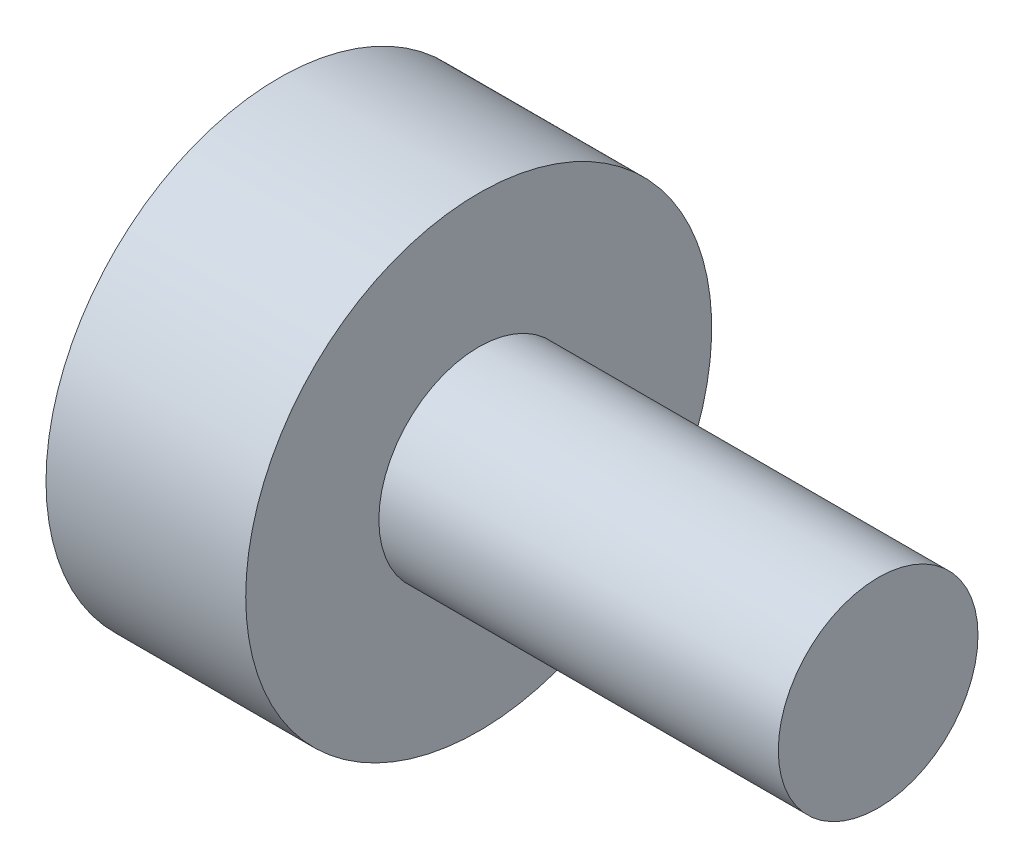
ISO-10303-21;
HEADER;
FILE_DESCRIPTION(('STEP AP214'),'2;1');
FILE_NAME('part.step','',(''),(''),'','','');
FILE_SCHEMA(('AUTOMOTIVE_DESIGN { 1 0 10303 214 1 1 1 1 }'));
ENDSEC;
DATA;
#1=APPLICATION_CONTEXT('core data for automotive mechanical design processes');
#2=APPLICATION_PROTOCOL_DEFINITION('international standard','automotive_design',2000,#1);
#3=PRODUCT_CONTEXT('',#1,'mechanical');
#4=PRODUCT('Part','Part','',(#3));
#5=PRODUCT_RELATED_PRODUCT_CATEGORY('part','',(#4));
#6=PRODUCT_DEFINITION_FORMATION('','',#4);
#7=PRODUCT_DEFINITION_CONTEXT('part definition',#1,'design');
#8=PRODUCT_DEFINITION('design','',#6,#7);
#9=PRODUCT_DEFINITION_SHAPE('','',#8);
#10=(LENGTH_UNIT() NAMED_UNIT(*) SI_UNIT(.MILLI.,.METRE.));
#11=(NAMED_UNIT(*) PLANE_ANGLE_UNIT() SI_UNIT($,.RADIAN.));
#12=(NAMED_UNIT(*) SI_UNIT($,.STERADIAN.) SOLID_ANGLE_UNIT());
#13=UNCERTAINTY_MEASURE_WITH_UNIT(LENGTH_MEASURE(1.E-05),#10,'distance_accuracy_value','');
#14=(GEOMETRIC_REPRESENTATION_CONTEXT(3) GLOBAL_UNCERTAINTY_ASSIGNED_CONTEXT((#13)) GLOBAL_UNIT_ASSIGNED_CONTEXT((#10,
#11,#12)) REPRESENTATION_CONTEXT('',''));
#15=CARTESIAN_POINT('',(0.,0.,0.));
#16=DIRECTION('',(0.,0.,1.));
#17=DIRECTION('',(1.,0.,0.));
#18=AXIS2_PLACEMENT_3D('',#15,#16,#17);
#19=CARTESIAN_POINT('',(0.,0.,0.));
#20=DIRECTION('',(1.,0.,0.));
#21=DIRECTION('',(0.,0.,-1.));
#22=AXIS2_PLACEMENT_3D('',#19,#20,#21);
#23=PLANE('',#22);
#24=CARTESIAN_POINT('',(0.,0.,0.));
#25=DIRECTION('',(-1.,0.,0.));
#26=DIRECTION('',(0.,0.,1.));
#27=AXIS2_PLACEMENT_3D('',#24,#25,#26);
#28=CIRCLE('',#27,20.);
#29=CARTESIAN_POINT('',(0.,0.,20.));
#30=VERTEX_POINT('',#29);
#31=EDGE_CURVE('E10',#30,#30,#28,.T.);
#32=ORIENTED_EDGE('',*,*,#31,.T.);
#33=EDGE_LOOP('',(#32));
#34=FACE_BOUND('',#33,.T.);
#35=ADVANCED_FACE('F37',(#34),#23,.F.);
#36=CARTESIAN_POINT('',(0.,0.,0.));
#37=DIRECTION('',(-1.,0.,0.));
#38=DIRECTION('',(0.,0.,1.));
#39=AXIS2_PLACEMENT_3D('',#36,#37,#38);
#40=CYLINDRICAL_SURFACE('',#39,20.);
#41=ORIENTED_EDGE('',*,*,#31,.F.);
#42=EDGE_LOOP('',(#41));
#43=FACE_BOUND('',#42,.T.);
#44=CARTESIAN_POINT('',(10.,0.,0.));
#45=DIRECTION('',(-1.,0.,0.));
#46=DIRECTION('',(0.,0.,1.));
#47=AXIS2_PLACEMENT_3D('',#44,#45,#46);
#48=CIRCLE('',#47,20.);
#49=CARTESIAN_POINT('',(10.,0.,20.));
#50=VERTEX_POINT('',#49);
#51=EDGE_CURVE('E43',#50,#50,#48,.T.);
#52=ORIENTED_EDGE('',*,*,#51,.T.);
#53=EDGE_LOOP('',(#52));
#54=FACE_BOUND('',#53,.T.);
#55=ADVANCED_FACE('F75',(#43,#54),#40,.T.);
#56=CARTESIAN_POINT('',(10.,20.,0.));
#57=DIRECTION('',(1.,0.,0.));
#58=DIRECTION('',(0.,0.,-1.));
#59=AXIS2_PLACEMENT_3D('',#56,#57,#58);
#60=PLANE('',#59);
#61=ORIENTED_EDGE('',*,*,#51,.F.);
#62=EDGE_LOOP('',(#61));
#63=FACE_BOUND('',#62,.T.);
#64=CARTESIAN_POINT('',(10.,0.,0.));
#65=DIRECTION('',(-1.,0.,0.));
#66=DIRECTION('',(0.,0.,1.));
#67=AXIS2_PLACEMENT_3D('',#64,#65,#66);
#68=CIRCLE('',#67,35.);
#69=CARTESIAN_POINT('',(10.,0.,35.));
#70=VERTEX_POINT('',#69);
#71=EDGE_CURVE('E47',#70,#70,#68,.T.);
#72=ORIENTED_EDGE('',*,*,#71,.T.);
#73=EDGE_LOOP('',(#72));
#74=FACE_BOUND('',#73,.T.);
#75=ADVANCED_FACE('F79',(#63,#74),#60,.F.);
#76=CARTESIAN_POINT('',(0.,0.,0.));
#77=DIRECTION('',(-1.,0.,0.));
#78=DIRECTION('',(0.,0.,1.));
#79=AXIS2_PLACEMENT_3D('',#76,#77,#78);
#80=CYLINDRICAL_SURFACE('',#79,35.);
#81=ORIENTED_EDGE('',*,*,#71,.F.);
#82=EDGE_LOOP('',(#81));
#83=FACE_BOUND('',#82,.T.);
#84=CARTESIAN_POINT('',(40.,0.,0.));
#85=DIRECTION('',(-1.,0.,0.));
#86=DIRECTION('',(0.,0.,1.));
#87=AXIS2_PLACEMENT_3D('',#84,#85,#86);
#88=CIRCLE('',#87,35.);
#89=CARTESIAN_POINT('',(40.,0.,35.));
#90=VERTEX_POINT('',#89);
#91=EDGE_CURVE('E51',#90,#90,#88,.T.);
#92=ORIENTED_EDGE('',*,*,#91,.T.);
#93=EDGE_LOOP('',(#92));
#94=FACE_BOUND('',#93,.T.);
#95=ADVANCED_FACE('F84',(#83,#94),#80,.T.);
#96=CARTESIAN_POINT('',(40.,35.,0.));
#97=DIRECTION('',(-1.,0.,0.));
#98=DIRECTION('',(0.,0.,1.));
#99=AXIS2_PLACEMENT_3D('',#96,#97,#98);
#100=PLANE('',#99);
#101=ORIENTED_EDGE('',*,*,#91,.F.);
#102=EDGE_LOOP('',(#101));
#103=FACE_BOUND('',#102,.T.);
#104=CARTESIAN_POINT('',(40.,0.,0.));
#105=DIRECTION('',(-1.,0.,0.));
#106=DIRECTION('',(0.,0.,1.));
#107=AXIS2_PLACEMENT_3D('',#104,#105,#106);
#108=CIRCLE('',#107,15.);
#109=CARTESIAN_POINT('',(40.,0.,15.));
#110=VERTEX_POINT('',#109);
#111=EDGE_CURVE('E56',#110,#110,#108,.T.);
#112=ORIENTED_EDGE('',*,*,#111,.T.);
#113=EDGE_LOOP('',(#112));
#114=FACE_BOUND('',#113,.T.);
#115=ADVANCED_FACE('F71',(#103,#114),#100,.F.);
#116=CARTESIAN_POINT('',(0.,0.,0.));
#117=DIRECTION('',(-1.,0.,0.));
#118=DIRECTION('',(0.,0.,1.));
#119=AXIS2_PLACEMENT_3D('',#116,#117,#118);
#120=CYLINDRICAL_SURFACE('',#119,15.);
#121=ORIENTED_EDGE('',*,*,#111,.F.);
#122=EDGE_LOOP('',(#121));
#123=FACE_BOUND('',#122,.T.);
#124=CARTESIAN_POINT('',(100.,0.,0.));
#125=DIRECTION('',(-1.,0.,0.));
#126=DIRECTION('',(0.,0.,1.));
#127=AXIS2_PLACEMENT_3D('',#124,#125,#126);
#128=CIRCLE('',#127,15.);
#129=CARTESIAN_POINT('',(100.,0.,15.));
#130=VERTEX_POINT('',#129);
#131=EDGE_CURVE('E59',#130,#130,#128,.T.);
#132=ORIENTED_EDGE('',*,*,#131,.T.);
#133=EDGE_LOOP('',(#132));
#134=FACE_BOUND('',#133,.T.);
#135=ADVANCED_FACE('F63',(#123,#134),#120,.T.);
#136=CARTESIAN_POINT('',(100.,0.,0.));
#137=DIRECTION('',(-1.,0.,0.));
#138=DIRECTION('',(0.,0.,1.));
#139=AXIS2_PLACEMENT_3D('',#136,#137,#138);
#140=PLANE('',#139);
#141=ORIENTED_EDGE('',*,*,#131,.F.);
#142=EDGE_LOOP('',(#141));
#143=FACE_BOUND('',#142,.T.);
#144=ADVANCED_FACE('F65',(#143),#140,.F.);
#145=CLOSED_SHELL('',(#35,#55,#75,#95,#115,#135,#144));
#146=MANIFOLD_SOLID_BREP('B2',#145);
#147=ADVANCED_BREP_SHAPE_REPRESENTATION('',(#18,#146),#14);
#148=SHAPE_DEFINITION_REPRESENTATION(#9,#147);
ENDSEC;
END-ISO-10303-21;
